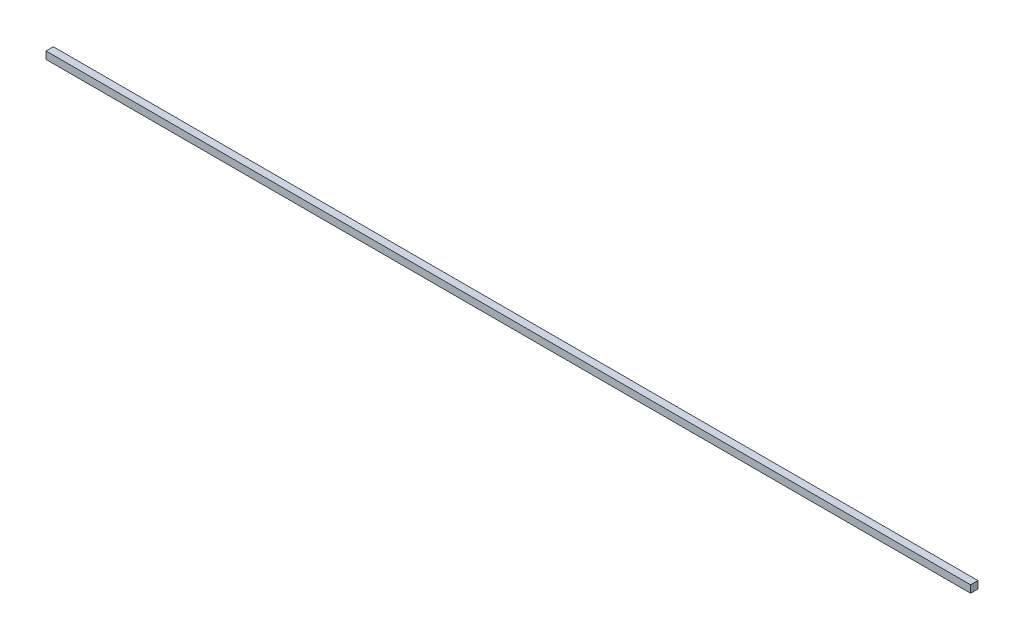
ISO-10303-21;
HEADER;
FILE_DESCRIPTION(('STEP AP214'),'2;1');
FILE_NAME('part.step','',(''),(''),'','','');
FILE_SCHEMA(('AUTOMOTIVE_DESIGN { 1 0 10303 214 1 1 1 1 }'));
ENDSEC;
DATA;
#1=APPLICATION_CONTEXT('core data for automotive mechanical design processes');
#2=APPLICATION_PROTOCOL_DEFINITION('international standard','automotive_design',2000,#1);
#3=PRODUCT_CONTEXT('',#1,'mechanical');
#4=PRODUCT('Part','Part','',(#3));
#5=PRODUCT_RELATED_PRODUCT_CATEGORY('part','',(#4));
#6=PRODUCT_DEFINITION_FORMATION('','',#4);
#7=PRODUCT_DEFINITION_CONTEXT('part definition',#1,'design');
#8=PRODUCT_DEFINITION('design','',#6,#7);
#9=PRODUCT_DEFINITION_SHAPE('','',#8);
#10=(LENGTH_UNIT() NAMED_UNIT(*) SI_UNIT(.MILLI.,.METRE.));
#11=(NAMED_UNIT(*) PLANE_ANGLE_UNIT() SI_UNIT($,.RADIAN.));
#12=(NAMED_UNIT(*) SI_UNIT($,.STERADIAN.) SOLID_ANGLE_UNIT());
#13=UNCERTAINTY_MEASURE_WITH_UNIT(LENGTH_MEASURE(1.E-05),#10,'distance_accuracy_value','');
#14=(GEOMETRIC_REPRESENTATION_CONTEXT(3) GLOBAL_UNCERTAINTY_ASSIGNED_CONTEXT((#13)) GLOBAL_UNIT_ASSIGNED_CONTEXT((#10,
#11,#12)) REPRESENTATION_CONTEXT('',''));
#15=CARTESIAN_POINT('',(0.,0.,0.));
#16=DIRECTION('',(0.,0.,1.));
#17=DIRECTION('',(1.,0.,0.));
#18=AXIS2_PLACEMENT_3D('',#15,#16,#17);
#19=CARTESIAN_POINT('',(0.,40.,0.));
#20=DIRECTION('',(1.,0.,0.));
#21=DIRECTION('',(0.,0.,-1.));
#22=AXIS2_PLACEMENT_3D('',#19,#20,#21);
#23=PLANE('',#22);
#24=DIRECTION('',(0.,0.,1.));
#25=VECTOR('',#24,1.);
#26=CARTESIAN_POINT('',(0.,0.,0.));
#27=LINE('',#26,#25);
#28=CARTESIAN_POINT('',(0.,0.,-40.));
#29=VERTEX_POINT('',#28);
#30=CARTESIAN_POINT('',(0.,0.,0.));
#31=VERTEX_POINT('',#30);
#32=EDGE_CURVE('E107',#29,#31,#27,.T.);
#33=ORIENTED_EDGE('',*,*,#32,.T.);
#34=DIRECTION('',(0.,-1.,0.));
#35=VECTOR('',#34,1.);
#36=CARTESIAN_POINT('',(0.,40.,0.));
#37=LINE('',#36,#35);
#38=CARTESIAN_POINT('',(0.,40.,0.));
#39=VERTEX_POINT('',#38);
#40=EDGE_CURVE('E11',#39,#31,#37,.T.);
#41=ORIENTED_EDGE('',*,*,#40,.F.);
#42=DIRECTION('',(0.,0.,1.));
#43=VECTOR('',#42,1.);
#44=CARTESIAN_POINT('',(0.,40.,0.));
#45=LINE('',#44,#43);
#46=CARTESIAN_POINT('',(0.,40.,-40.));
#47=VERTEX_POINT('',#46);
#48=EDGE_CURVE('E91',#47,#39,#45,.T.);
#49=ORIENTED_EDGE('',*,*,#48,.F.);
#50=DIRECTION('',(0.,-1.,0.));
#51=VECTOR('',#50,1.);
#52=CARTESIAN_POINT('',(0.,40.,-40.));
#53=LINE('',#52,#51);
#54=EDGE_CURVE('E103',#47,#29,#53,.T.);
#55=ORIENTED_EDGE('',*,*,#54,.T.);
#56=EDGE_LOOP('',(#33,#41,#49,#55));
#57=FACE_BOUND('',#56,.T.);
#58=ADVANCED_FACE('F39',(#57),#23,.F.);
#59=CARTESIAN_POINT('',(0.,40.,0.));
#60=DIRECTION('',(0.,0.,-1.));
#61=DIRECTION('',(-1.,0.,0.));
#62=AXIS2_PLACEMENT_3D('',#59,#60,#61);
#63=PLANE('',#62);
#64=DIRECTION('',(1.,0.,0.));
#65=VECTOR('',#64,1.);
#66=CARTESIAN_POINT('',(0.,0.,0.));
#67=LINE('',#66,#65);
#68=CARTESIAN_POINT('',(5035.,0.,0.));
#69=VERTEX_POINT('',#68);
#70=EDGE_CURVE('E96',#31,#69,#67,.T.);
#71=ORIENTED_EDGE('',*,*,#70,.T.);
#72=DIRECTION('',(0.,-1.,0.));
#73=VECTOR('',#72,1.);
#74=CARTESIAN_POINT('',(5035.,40.,0.));
#75=LINE('',#74,#73);
#76=CARTESIAN_POINT('',(5035.,40.,0.));
#77=VERTEX_POINT('',#76);
#78=EDGE_CURVE('E48',#77,#69,#75,.T.);
#79=ORIENTED_EDGE('',*,*,#78,.F.);
#80=DIRECTION('',(1.,0.,0.));
#81=VECTOR('',#80,1.);
#82=CARTESIAN_POINT('',(0.,40.,0.));
#83=LINE('',#82,#81);
#84=EDGE_CURVE('E86',#39,#77,#83,.T.);
#85=ORIENTED_EDGE('',*,*,#84,.F.);
#86=ORIENTED_EDGE('',*,*,#40,.T.);
#87=EDGE_LOOP('',(#71,#79,#85,#86));
#88=FACE_BOUND('',#87,.T.);
#89=ADVANCED_FACE('F95',(#88),#63,.F.);
#90=CARTESIAN_POINT('',(5035.,40.,0.));
#91=DIRECTION('',(-1.,0.,0.));
#92=DIRECTION('',(0.,0.,1.));
#93=AXIS2_PLACEMENT_3D('',#90,#91,#92);
#94=PLANE('',#93);
#95=DIRECTION('',(0.,0.,-1.));
#96=VECTOR('',#95,1.);
#97=CARTESIAN_POINT('',(5035.,0.,0.));
#98=LINE('',#97,#96);
#99=CARTESIAN_POINT('',(5035.,0.,-40.));
#100=VERTEX_POINT('',#99);
#101=EDGE_CURVE('E73',#69,#100,#98,.T.);
#102=ORIENTED_EDGE('',*,*,#101,.T.);
#103=DIRECTION('',(0.,-1.,0.));
#104=VECTOR('',#103,1.);
#105=CARTESIAN_POINT('',(5035.,40.,-40.));
#106=LINE('',#105,#104);
#107=CARTESIAN_POINT('',(5035.,40.,-40.));
#108=VERTEX_POINT('',#107);
#109=EDGE_CURVE('E98',#108,#100,#106,.T.);
#110=ORIENTED_EDGE('',*,*,#109,.F.);
#111=DIRECTION('',(0.,0.,-1.));
#112=VECTOR('',#111,1.);
#113=CARTESIAN_POINT('',(5035.,40.,0.));
#114=LINE('',#113,#112);
#115=EDGE_CURVE('E89',#77,#108,#114,.T.);
#116=ORIENTED_EDGE('',*,*,#115,.F.);
#117=ORIENTED_EDGE('',*,*,#78,.T.);
#118=EDGE_LOOP('',(#102,#110,#116,#117));
#119=FACE_BOUND('',#118,.T.);
#120=ADVANCED_FACE('F99',(#119),#94,.F.);
#121=CARTESIAN_POINT('',(0.,40.,-40.));
#122=DIRECTION('',(0.,0.,1.));
#123=DIRECTION('',(1.,0.,0.));
#124=AXIS2_PLACEMENT_3D('',#121,#122,#123);
#125=PLANE('',#124);
#126=DIRECTION('',(-1.,0.,0.));
#127=VECTOR('',#126,1.);
#128=CARTESIAN_POINT('',(0.,0.,-40.));
#129=LINE('',#128,#127);
#130=EDGE_CURVE('E79',#100,#29,#129,.T.);
#131=ORIENTED_EDGE('',*,*,#130,.T.);
#132=ORIENTED_EDGE('',*,*,#54,.F.);
#133=DIRECTION('',(-1.,0.,0.));
#134=VECTOR('',#133,1.);
#135=CARTESIAN_POINT('',(0.,40.,-40.));
#136=LINE('',#135,#134);
#137=EDGE_CURVE('E56',#108,#47,#136,.T.);
#138=ORIENTED_EDGE('',*,*,#137,.F.);
#139=ORIENTED_EDGE('',*,*,#109,.T.);
#140=EDGE_LOOP('',(#131,#132,#138,#139));
#141=FACE_BOUND('',#140,.T.);
#142=ADVANCED_FACE('F120',(#141),#125,.F.);
#143=CARTESIAN_POINT('',(0.,40.,0.));
#144=DIRECTION('',(0.,-1.,0.));
#145=DIRECTION('',(0.,0.,-1.));
#146=AXIS2_PLACEMENT_3D('',#143,#144,#145);
#147=PLANE('',#146);
#148=ORIENTED_EDGE('',*,*,#48,.T.);
#149=ORIENTED_EDGE('',*,*,#84,.T.);
#150=ORIENTED_EDGE('',*,*,#115,.T.);
#151=ORIENTED_EDGE('',*,*,#137,.T.);
#152=EDGE_LOOP('',(#148,#149,#150,#151));
#153=FACE_BOUND('',#152,.T.);
#154=ADVANCED_FACE('F87',(#153),#147,.F.);
#155=CARTESIAN_POINT('',(0.,0.,0.));
#156=DIRECTION('',(0.,-1.,0.));
#157=DIRECTION('',(0.,0.,-1.));
#158=AXIS2_PLACEMENT_3D('',#155,#156,#157);
#159=PLANE('',#158);
#160=ORIENTED_EDGE('',*,*,#32,.F.);
#161=ORIENTED_EDGE('',*,*,#130,.F.);
#162=ORIENTED_EDGE('',*,*,#101,.F.);
#163=ORIENTED_EDGE('',*,*,#70,.F.);
#164=EDGE_LOOP('',(#160,#161,#162,#163));
#165=FACE_BOUND('',#164,.T.);
#166=ADVANCED_FACE('F123',(#165),#159,.T.);
#167=CLOSED_SHELL('',(#58,#89,#120,#142,#154,#166));
#168=MANIFOLD_SOLID_BREP('B2',#167);
#169=ADVANCED_BREP_SHAPE_REPRESENTATION('',(#18,#168),#14);
#170=SHAPE_DEFINITION_REPRESENTATION(#9,#169);
ENDSEC;
END-ISO-10303-21;
